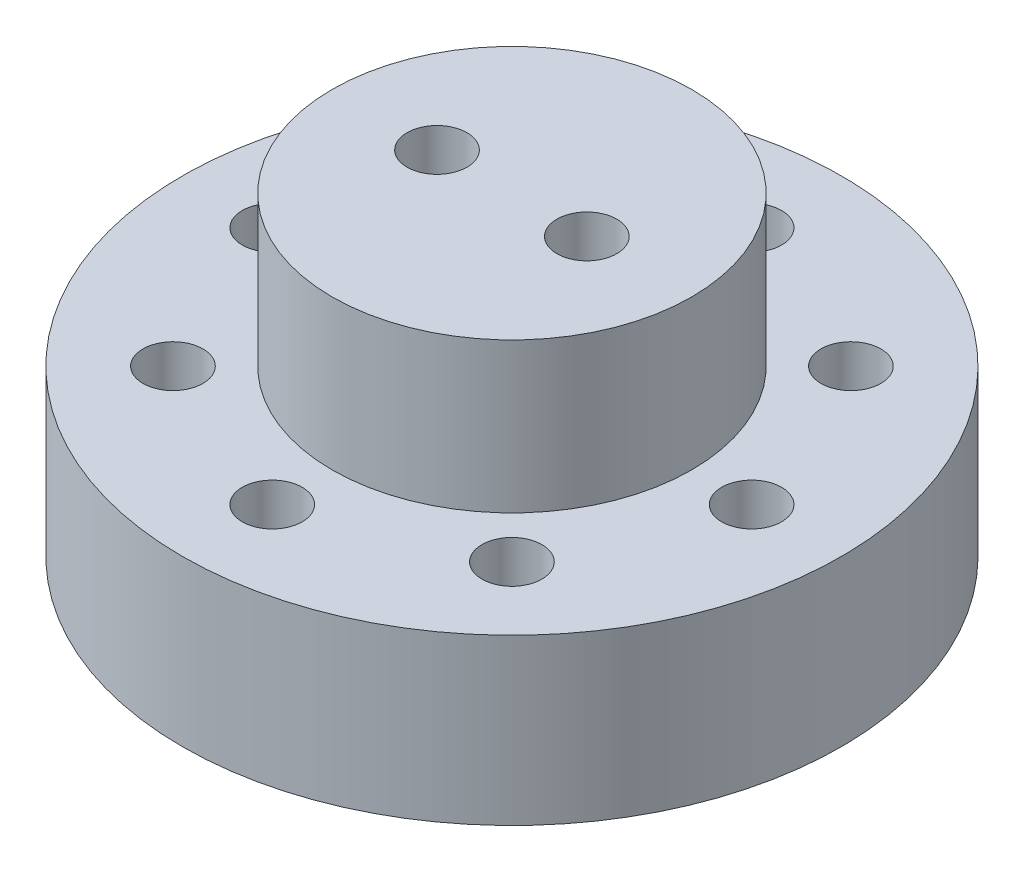
ISO-10303-21;
HEADER;
FILE_DESCRIPTION(('STEP AP214'),'2;1');
FILE_NAME('part.step','',(''),(''),'','','');
FILE_SCHEMA(('AUTOMOTIVE_DESIGN { 1 0 10303 214 1 1 1 1 }'));
ENDSEC;
DATA;
#1=APPLICATION_CONTEXT('core data for automotive mechanical design processes');
#2=APPLICATION_PROTOCOL_DEFINITION('international standard','automotive_design',2000,#1);
#3=PRODUCT_CONTEXT('',#1,'mechanical');
#4=PRODUCT('Part','Part','',(#3));
#5=PRODUCT_RELATED_PRODUCT_CATEGORY('part','',(#4));
#6=PRODUCT_DEFINITION_FORMATION('','',#4);
#7=PRODUCT_DEFINITION_CONTEXT('part definition',#1,'design');
#8=PRODUCT_DEFINITION('design','',#6,#7);
#9=PRODUCT_DEFINITION_SHAPE('','',#8);
#10=(LENGTH_UNIT() NAMED_UNIT(*) SI_UNIT(.MILLI.,.METRE.));
#11=(NAMED_UNIT(*) PLANE_ANGLE_UNIT() SI_UNIT($,.RADIAN.));
#12=(NAMED_UNIT(*) SI_UNIT($,.STERADIAN.) SOLID_ANGLE_UNIT());
#13=UNCERTAINTY_MEASURE_WITH_UNIT(LENGTH_MEASURE(1.E-05),#10,'distance_accuracy_value','');
#14=(GEOMETRIC_REPRESENTATION_CONTEXT(3) GLOBAL_UNCERTAINTY_ASSIGNED_CONTEXT((#13)) GLOBAL_UNIT_ASSIGNED_CONTEXT((#10,
#11,#12)) REPRESENTATION_CONTEXT('',''));
#15=CARTESIAN_POINT('',(0.,0.,0.));
#16=DIRECTION('',(0.,0.,1.));
#17=DIRECTION('',(1.,0.,0.));
#18=AXIS2_PLACEMENT_3D('',#15,#16,#17);
#19=CARTESIAN_POINT('',(0.,5.5,0.));
#20=DIRECTION('',(0.,1.,0.));
#21=DIRECTION('',(0.,0.,1.));
#22=AXIS2_PLACEMENT_3D('',#19,#20,#21);
#23=PLANE('',#22);
#24=CARTESIAN_POINT('',(0.,5.5,0.));
#25=DIRECTION('',(0.,1.,0.));
#26=DIRECTION('',(0.,0.,1.));
#27=AXIS2_PLACEMENT_3D('',#24,#25,#26);
#28=CIRCLE('',#27,6.);
#29=CARTESIAN_POINT('',(0.,5.5,6.));
#30=VERTEX_POINT('',#29);
#31=EDGE_CURVE('E104',#30,#30,#28,.T.);
#32=ORIENTED_EDGE('',*,*,#31,.F.);
#33=EDGE_LOOP('',(#32));
#34=FACE_BOUND('',#33,.T.);
#35=CARTESIAN_POINT('',(-8.,5.5,6.82091801405444E-13));
#36=DIRECTION('',(0.,1.,0.));
#37=DIRECTION('',(0.,0.,1.));
#38=AXIS2_PLACEMENT_3D('',#35,#36,#37);
#39=CIRCLE('',#38,1.00000000000073);
#40=CARTESIAN_POINT('',(-8.,5.5,1.00000000000141));
#41=VERTEX_POINT('',#40);
#42=EDGE_CURVE('E83',#41,#41,#39,.T.);
#43=ORIENTED_EDGE('',*,*,#42,.F.);
#44=EDGE_LOOP('',(#43));
#45=FACE_BOUND('',#44,.T.);
#46=CARTESIAN_POINT('',(6.82212565349343E-13,5.5,8.00000000000068));
#47=DIRECTION('',(0.,1.,0.));
#48=DIRECTION('',(0.,0.,1.));
#49=AXIS2_PLACEMENT_3D('',#46,#47,#48);
#50=CIRCLE('',#49,1.00000000000051);
#51=CARTESIAN_POINT('',(6.82212565349343E-13,5.5,9.00000000000119));
#52=VERTEX_POINT('',#51);
#53=EDGE_CURVE('E71',#52,#52,#50,.T.);
#54=ORIENTED_EDGE('',*,*,#53,.F.);
#55=EDGE_LOOP('',(#54));
#56=FACE_BOUND('',#55,.T.);
#57=CARTESIAN_POINT('',(8.00000000000068,5.5,0.));
#58=DIRECTION('',(0.,1.,0.));
#59=DIRECTION('',(0.,0.,1.));
#60=AXIS2_PLACEMENT_3D('',#57,#58,#59);
#61=CIRCLE('',#60,0.999999999999828);
#62=CARTESIAN_POINT('',(8.00000000000068,5.5,0.999999999999828));
#63=VERTEX_POINT('',#62);
#64=EDGE_CURVE('E59',#63,#63,#61,.T.);
#65=ORIENTED_EDGE('',*,*,#64,.F.);
#66=EDGE_LOOP('',(#65));
#67=FACE_BOUND('',#66,.T.);
#68=CARTESIAN_POINT('',(0.,5.5,-8.));
#69=DIRECTION('',(0.,1.,0.));
#70=DIRECTION('',(0.,0.,1.));
#71=AXIS2_PLACEMENT_3D('',#68,#69,#70);
#72=CIRCLE('',#71,1.);
#73=CARTESIAN_POINT('',(0.,5.5,-7.));
#74=VERTEX_POINT('',#73);
#75=EDGE_CURVE('E48',#74,#74,#72,.T.);
#76=ORIENTED_EDGE('',*,*,#75,.F.);
#77=EDGE_LOOP('',(#76));
#78=FACE_BOUND('',#77,.T.);
#79=CARTESIAN_POINT('',(0.,5.5,0.));
#80=DIRECTION('',(0.,1.,0.));
#81=DIRECTION('',(0.,0.,1.));
#82=AXIS2_PLACEMENT_3D('',#79,#80,#81);
#83=CIRCLE('',#82,11.);
#84=CARTESIAN_POINT('',(0.,5.5,11.));
#85=VERTEX_POINT('',#84);
#86=EDGE_CURVE('E10',#85,#85,#83,.T.);
#87=ORIENTED_EDGE('',*,*,#86,.T.);
#88=EDGE_LOOP('',(#87));
#89=FACE_BOUND('',#88,.T.);
#90=CARTESIAN_POINT('',(5.65685424949272,5.5,-5.65685424949252));
#91=DIRECTION('',(0.,1.,0.));
#92=DIRECTION('',(0.,0.,1.));
#93=AXIS2_PLACEMENT_3D('',#90,#91,#92);
#94=CIRCLE('',#93,0.99999999999978);
#95=CARTESIAN_POINT('',(5.65685424949272,5.5,-4.65685424949274));
#96=VERTEX_POINT('',#95);
#97=EDGE_CURVE('E53',#96,#96,#94,.T.);
#98=ORIENTED_EDGE('',*,*,#97,.F.);
#99=EDGE_LOOP('',(#98));
#100=FACE_BOUND('',#99,.T.);
#101=CARTESIAN_POINT('',(5.6568542494932,5.5,5.65685424949272));
#102=DIRECTION('',(0.,1.,0.));
#103=DIRECTION('',(0.,0.,1.));
#104=AXIS2_PLACEMENT_3D('',#101,#102,#103);
#105=CIRCLE('',#104,1.00000000000013);
#106=CARTESIAN_POINT('',(5.6568542494932,5.5,6.65685424949285));
#107=VERTEX_POINT('',#106);
#108=EDGE_CURVE('E65',#107,#107,#105,.T.);
#109=ORIENTED_EDGE('',*,*,#108,.F.);
#110=EDGE_LOOP('',(#109));
#111=FACE_BOUND('',#110,.T.);
#112=CARTESIAN_POINT('',(-5.65685424949204,5.5,5.6568542494932));
#113=DIRECTION('',(0.,1.,0.));
#114=DIRECTION('',(0.,0.,1.));
#115=AXIS2_PLACEMENT_3D('',#112,#113,#114);
#116=CIRCLE('',#115,1.00000000000076);
#117=CARTESIAN_POINT('',(-5.65685424949204,5.5,6.65685424949396));
#118=VERTEX_POINT('',#117);
#119=EDGE_CURVE('E77',#118,#118,#116,.T.);
#120=ORIENTED_EDGE('',*,*,#119,.F.);
#121=EDGE_LOOP('',(#120));
#122=FACE_BOUND('',#121,.T.);
#123=CARTESIAN_POINT('',(-5.65685424949252,5.5,-5.65685424949204));
#124=DIRECTION('',(0.,1.,0.));
#125=DIRECTION('',(0.,0.,1.));
#126=AXIS2_PLACEMENT_3D('',#123,#124,#125);
#127=CIRCLE('',#126,1.00000000000046);
#128=CARTESIAN_POINT('',(-5.65685424949252,5.5,-4.65685424949158));
#129=VERTEX_POINT('',#128);
#130=EDGE_CURVE('E89',#129,#129,#127,.T.);
#131=ORIENTED_EDGE('',*,*,#130,.F.);
#132=EDGE_LOOP('',(#131));
#133=FACE_BOUND('',#132,.T.);
#134=ADVANCED_FACE('F37',(#34,#45,#56,#67,#78,#89,#100,#111,#122,#133),#23,.T.);
#135=CARTESIAN_POINT('',(0.,0.,0.));
#136=DIRECTION('',(0.,1.,0.));
#137=DIRECTION('',(0.,0.,1.));
#138=AXIS2_PLACEMENT_3D('',#135,#136,#137);
#139=PLANE('',#138);
#140=CARTESIAN_POINT('',(0.,0.,0.));
#141=DIRECTION('',(0.,1.,0.));
#142=DIRECTION('',(0.,0.,1.));
#143=AXIS2_PLACEMENT_3D('',#140,#141,#142);
#144=CIRCLE('',#143,4.);
#145=CARTESIAN_POINT('',(0.,0.,4.));
#146=VERTEX_POINT('',#145);
#147=EDGE_CURVE('E95',#146,#146,#144,.T.);
#148=ORIENTED_EDGE('',*,*,#147,.T.);
#149=EDGE_LOOP('',(#148));
#150=FACE_BOUND('',#149,.T.);
#151=CARTESIAN_POINT('',(0.,0.,0.));
#152=DIRECTION('',(0.,1.,0.));
#153=DIRECTION('',(0.,0.,1.));
#154=AXIS2_PLACEMENT_3D('',#151,#152,#153);
#155=CIRCLE('',#154,11.);
#156=CARTESIAN_POINT('',(0.,0.,11.));
#157=VERTEX_POINT('',#156);
#158=EDGE_CURVE('E41',#157,#157,#155,.T.);
#159=ORIENTED_EDGE('',*,*,#158,.F.);
#160=EDGE_LOOP('',(#159));
#161=FACE_BOUND('',#160,.T.);
#162=CARTESIAN_POINT('',(0.,0.,-8.));
#163=DIRECTION('',(0.,1.,0.));
#164=DIRECTION('',(0.,0.,1.));
#165=AXIS2_PLACEMENT_3D('',#162,#163,#164);
#166=CIRCLE('',#165,1.);
#167=CARTESIAN_POINT('',(0.,0.,-7.));
#168=VERTEX_POINT('',#167);
#169=EDGE_CURVE('E50',#168,#168,#166,.T.);
#170=ORIENTED_EDGE('',*,*,#169,.T.);
#171=EDGE_LOOP('',(#170));
#172=FACE_BOUND('',#171,.T.);
#173=CARTESIAN_POINT('',(5.65685424949272,0.,-5.65685424949252));
#174=DIRECTION('',(0.,1.,0.));
#175=DIRECTION('',(0.,0.,1.));
#176=AXIS2_PLACEMENT_3D('',#173,#174,#175);
#177=CIRCLE('',#176,0.99999999999978);
#178=CARTESIAN_POINT('',(5.65685424949272,0.,-4.65685424949274));
#179=VERTEX_POINT('',#178);
#180=EDGE_CURVE('E56',#179,#179,#177,.T.);
#181=ORIENTED_EDGE('',*,*,#180,.T.);
#182=EDGE_LOOP('',(#181));
#183=FACE_BOUND('',#182,.T.);
#184=CARTESIAN_POINT('',(8.00000000000068,0.,0.));
#185=DIRECTION('',(0.,1.,0.));
#186=DIRECTION('',(0.,0.,1.));
#187=AXIS2_PLACEMENT_3D('',#184,#185,#186);
#188=CIRCLE('',#187,0.999999999999828);
#189=CARTESIAN_POINT('',(8.00000000000068,0.,0.999999999999828));
#190=VERTEX_POINT('',#189);
#191=EDGE_CURVE('E62',#190,#190,#188,.T.);
#192=ORIENTED_EDGE('',*,*,#191,.T.);
#193=EDGE_LOOP('',(#192));
#194=FACE_BOUND('',#193,.T.);
#195=CARTESIAN_POINT('',(5.6568542494932,0.,5.65685424949272));
#196=DIRECTION('',(0.,1.,0.));
#197=DIRECTION('',(0.,0.,1.));
#198=AXIS2_PLACEMENT_3D('',#195,#196,#197);
#199=CIRCLE('',#198,1.00000000000013);
#200=CARTESIAN_POINT('',(5.6568542494932,0.,6.65685424949285));
#201=VERTEX_POINT('',#200);
#202=EDGE_CURVE('E68',#201,#201,#199,.T.);
#203=ORIENTED_EDGE('',*,*,#202,.T.);
#204=EDGE_LOOP('',(#203));
#205=FACE_BOUND('',#204,.T.);
#206=CARTESIAN_POINT('',(6.82212565349343E-13,0.,8.00000000000068));
#207=DIRECTION('',(0.,1.,0.));
#208=DIRECTION('',(0.,0.,1.));
#209=AXIS2_PLACEMENT_3D('',#206,#207,#208);
#210=CIRCLE('',#209,1.00000000000051);
#211=CARTESIAN_POINT('',(6.82212565349343E-13,0.,9.00000000000119));
#212=VERTEX_POINT('',#211);
#213=EDGE_CURVE('E74',#212,#212,#210,.T.);
#214=ORIENTED_EDGE('',*,*,#213,.T.);
#215=EDGE_LOOP('',(#214));
#216=FACE_BOUND('',#215,.T.);
#217=CARTESIAN_POINT('',(-5.65685424949204,0.,5.6568542494932));
#218=DIRECTION('',(0.,1.,0.));
#219=DIRECTION('',(0.,0.,1.));
#220=AXIS2_PLACEMENT_3D('',#217,#218,#219);
#221=CIRCLE('',#220,1.00000000000076);
#222=CARTESIAN_POINT('',(-5.65685424949204,0.,6.65685424949396));
#223=VERTEX_POINT('',#222);
#224=EDGE_CURVE('E80',#223,#223,#221,.T.);
#225=ORIENTED_EDGE('',*,*,#224,.T.);
#226=EDGE_LOOP('',(#225));
#227=FACE_BOUND('',#226,.T.);
#228=CARTESIAN_POINT('',(-8.,0.,6.82091801405444E-13));
#229=DIRECTION('',(0.,1.,0.));
#230=DIRECTION('',(0.,0.,1.));
#231=AXIS2_PLACEMENT_3D('',#228,#229,#230);
#232=CIRCLE('',#231,1.00000000000073);
#233=CARTESIAN_POINT('',(-8.,0.,1.00000000000141));
#234=VERTEX_POINT('',#233);
#235=EDGE_CURVE('E86',#234,#234,#232,.T.);
#236=ORIENTED_EDGE('',*,*,#235,.T.);
#237=EDGE_LOOP('',(#236));
#238=FACE_BOUND('',#237,.T.);
#239=CARTESIAN_POINT('',(-5.65685424949252,0.,-5.65685424949204));
#240=DIRECTION('',(0.,1.,0.));
#241=DIRECTION('',(0.,0.,1.));
#242=AXIS2_PLACEMENT_3D('',#239,#240,#241);
#243=CIRCLE('',#242,1.00000000000046);
#244=CARTESIAN_POINT('',(-5.65685424949252,0.,-4.65685424949158));
#245=VERTEX_POINT('',#244);
#246=EDGE_CURVE('E92',#245,#245,#243,.T.);
#247=ORIENTED_EDGE('',*,*,#246,.T.);
#248=EDGE_LOOP('',(#247));
#249=FACE_BOUND('',#248,.T.);
#250=ADVANCED_FACE('F143',(#150,#161,#172,#183,#194,#205,#216,#227,#238,#249),#139,.F.);
#251=CARTESIAN_POINT('',(0.,5.5,0.));
#252=DIRECTION('',(0.,-1.,0.));
#253=DIRECTION('',(0.,0.,-1.));
#254=AXIS2_PLACEMENT_3D('',#251,#252,#253);
#255=CYLINDRICAL_SURFACE('',#254,11.);
#256=ORIENTED_EDGE('',*,*,#86,.F.);
#257=EDGE_LOOP('',(#256));
#258=FACE_BOUND('',#257,.T.);
#259=ORIENTED_EDGE('',*,*,#158,.T.);
#260=EDGE_LOOP('',(#259));
#261=FACE_BOUND('',#260,.T.);
#262=ADVANCED_FACE('F39',(#258,#261),#255,.T.);
#263=CARTESIAN_POINT('',(0.,5.5,-8.));
#264=DIRECTION('',(0.,-1.,0.));
#265=DIRECTION('',(0.,0.,-1.));
#266=AXIS2_PLACEMENT_3D('',#263,#264,#265);
#267=CYLINDRICAL_SURFACE('',#266,1.);
#268=ORIENTED_EDGE('',*,*,#75,.T.);
#269=EDGE_LOOP('',(#268));
#270=FACE_BOUND('',#269,.T.);
#271=ORIENTED_EDGE('',*,*,#169,.F.);
#272=EDGE_LOOP('',(#271));
#273=FACE_BOUND('',#272,.T.);
#274=ADVANCED_FACE('F174',(#270,#273),#267,.F.);
#275=CARTESIAN_POINT('',(5.65685424949272,5.5,-5.65685424949252));
#276=DIRECTION('',(0.,-1.,0.));
#277=DIRECTION('',(0.,0.,-1.));
#278=AXIS2_PLACEMENT_3D('',#275,#276,#277);
#279=CYLINDRICAL_SURFACE('',#278,0.99999999999978);
#280=ORIENTED_EDGE('',*,*,#97,.T.);
#281=EDGE_LOOP('',(#280));
#282=FACE_BOUND('',#281,.T.);
#283=ORIENTED_EDGE('',*,*,#180,.F.);
#284=EDGE_LOOP('',(#283));
#285=FACE_BOUND('',#284,.T.);
#286=ADVANCED_FACE('F180',(#282,#285),#279,.F.);
#287=CARTESIAN_POINT('',(8.00000000000068,5.5,0.));
#288=DIRECTION('',(0.,-1.,0.));
#289=DIRECTION('',(0.,0.,-1.));
#290=AXIS2_PLACEMENT_3D('',#287,#288,#289);
#291=CYLINDRICAL_SURFACE('',#290,0.999999999999828);
#292=ORIENTED_EDGE('',*,*,#64,.T.);
#293=EDGE_LOOP('',(#292));
#294=FACE_BOUND('',#293,.T.);
#295=ORIENTED_EDGE('',*,*,#191,.F.);
#296=EDGE_LOOP('',(#295));
#297=FACE_BOUND('',#296,.T.);
#298=ADVANCED_FACE('F184',(#294,#297),#291,.F.);
#299=CARTESIAN_POINT('',(5.6568542494932,5.5,5.65685424949272));
#300=DIRECTION('',(0.,-1.,0.));
#301=DIRECTION('',(0.,0.,-1.));
#302=AXIS2_PLACEMENT_3D('',#299,#300,#301);
#303=CYLINDRICAL_SURFACE('',#302,1.00000000000013);
#304=ORIENTED_EDGE('',*,*,#108,.T.);
#305=EDGE_LOOP('',(#304));
#306=FACE_BOUND('',#305,.T.);
#307=ORIENTED_EDGE('',*,*,#202,.F.);
#308=EDGE_LOOP('',(#307));
#309=FACE_BOUND('',#308,.T.);
#310=ADVANCED_FACE('F188',(#306,#309),#303,.F.);
#311=CARTESIAN_POINT('',(6.82212565349343E-13,5.5,8.00000000000068));
#312=DIRECTION('',(0.,-1.,0.));
#313=DIRECTION('',(0.,0.,-1.));
#314=AXIS2_PLACEMENT_3D('',#311,#312,#313);
#315=CYLINDRICAL_SURFACE('',#314,1.00000000000051);
#316=ORIENTED_EDGE('',*,*,#53,.T.);
#317=EDGE_LOOP('',(#316));
#318=FACE_BOUND('',#317,.T.);
#319=ORIENTED_EDGE('',*,*,#213,.F.);
#320=EDGE_LOOP('',(#319));
#321=FACE_BOUND('',#320,.T.);
#322=ADVANCED_FACE('F192',(#318,#321),#315,.F.);
#323=CARTESIAN_POINT('',(-5.65685424949204,5.5,5.6568542494932));
#324=DIRECTION('',(0.,-1.,0.));
#325=DIRECTION('',(0.,0.,-1.));
#326=AXIS2_PLACEMENT_3D('',#323,#324,#325);
#327=CYLINDRICAL_SURFACE('',#326,1.00000000000076);
#328=ORIENTED_EDGE('',*,*,#119,.T.);
#329=EDGE_LOOP('',(#328));
#330=FACE_BOUND('',#329,.T.);
#331=ORIENTED_EDGE('',*,*,#224,.F.);
#332=EDGE_LOOP('',(#331));
#333=FACE_BOUND('',#332,.T.);
#334=ADVANCED_FACE('F196',(#330,#333),#327,.F.);
#335=CARTESIAN_POINT('',(-8.,5.5,6.82091801405444E-13));
#336=DIRECTION('',(0.,-1.,0.));
#337=DIRECTION('',(0.,0.,-1.));
#338=AXIS2_PLACEMENT_3D('',#335,#336,#337);
#339=CYLINDRICAL_SURFACE('',#338,1.00000000000073);
#340=ORIENTED_EDGE('',*,*,#42,.T.);
#341=EDGE_LOOP('',(#340));
#342=FACE_BOUND('',#341,.T.);
#343=ORIENTED_EDGE('',*,*,#235,.F.);
#344=EDGE_LOOP('',(#343));
#345=FACE_BOUND('',#344,.T.);
#346=ADVANCED_FACE('F165',(#342,#345),#339,.F.);
#347=CARTESIAN_POINT('',(-5.65685424949252,5.5,-5.65685424949204));
#348=DIRECTION('',(0.,-1.,0.));
#349=DIRECTION('',(0.,0.,-1.));
#350=AXIS2_PLACEMENT_3D('',#347,#348,#349);
#351=CYLINDRICAL_SURFACE('',#350,1.00000000000046);
#352=ORIENTED_EDGE('',*,*,#130,.T.);
#353=EDGE_LOOP('',(#352));
#354=FACE_BOUND('',#353,.T.);
#355=ORIENTED_EDGE('',*,*,#246,.F.);
#356=EDGE_LOOP('',(#355));
#357=FACE_BOUND('',#356,.T.);
#358=ADVANCED_FACE('F161',(#354,#357),#351,.F.);
#359=CARTESIAN_POINT('',(0.,0.,0.));
#360=DIRECTION('',(0.,1.,0.));
#361=DIRECTION('',(0.,0.,1.));
#362=AXIS2_PLACEMENT_3D('',#359,#360,#361);
#363=CYLINDRICAL_SURFACE('',#362,4.);
#364=ORIENTED_EDGE('',*,*,#147,.F.);
#365=EDGE_LOOP('',(#364));
#366=FACE_BOUND('',#365,.T.);
#367=CARTESIAN_POINT('',(0.,5.5,0.));
#368=DIRECTION('',(0.,1.,0.));
#369=DIRECTION('',(0.,0.,1.));
#370=AXIS2_PLACEMENT_3D('',#367,#368,#369);
#371=CIRCLE('',#370,4.);
#372=CARTESIAN_POINT('',(0.,5.5,4.));
#373=VERTEX_POINT('',#372);
#374=EDGE_CURVE('E100',#373,#373,#371,.F.);
#375=ORIENTED_EDGE('',*,*,#374,.F.);
#376=EDGE_LOOP('',(#375));
#377=FACE_BOUND('',#376,.T.);
#378=ADVANCED_FACE('F164',(#366,#377),#363,.F.);
#379=CARTESIAN_POINT('',(0.,5.5,0.));
#380=DIRECTION('',(0.,1.,0.));
#381=DIRECTION('',(0.,0.,1.));
#382=AXIS2_PLACEMENT_3D('',#379,#380,#381);
#383=PLANE('',#382);
#384=CARTESIAN_POINT('',(-2.5,5.5,0.));
#385=DIRECTION('',(0.,1.,0.));
#386=DIRECTION('',(0.,0.,1.));
#387=AXIS2_PLACEMENT_3D('',#384,#385,#386);
#388=CIRCLE('',#387,1.);
#389=CARTESIAN_POINT('',(-2.5,5.5,1.));
#390=VERTEX_POINT('',#389);
#391=EDGE_CURVE('E107',#390,#390,#388,.T.);
#392=ORIENTED_EDGE('',*,*,#391,.T.);
#393=EDGE_LOOP('',(#392));
#394=FACE_BOUND('',#393,.T.);
#395=CARTESIAN_POINT('',(2.5,5.5,0.));
#396=DIRECTION('',(0.,1.,0.));
#397=DIRECTION('',(0.,0.,1.));
#398=AXIS2_PLACEMENT_3D('',#395,#396,#397);
#399=CIRCLE('',#398,1.);
#400=CARTESIAN_POINT('',(2.5,5.5,0.999999999999999));
#401=VERTEX_POINT('',#400);
#402=EDGE_CURVE('E112',#401,#401,#399,.T.);
#403=ORIENTED_EDGE('',*,*,#402,.T.);
#404=EDGE_LOOP('',(#403));
#405=FACE_BOUND('',#404,.T.);
#406=ORIENTED_EDGE('',*,*,#374,.T.);
#407=EDGE_LOOP('',(#406));
#408=FACE_BOUND('',#407,.T.);
#409=ADVANCED_FACE('F137',(#394,#405,#408),#383,.F.);
#410=CARTESIAN_POINT('',(0.,10.5,0.));
#411=DIRECTION('',(0.,-1.,0.));
#412=DIRECTION('',(0.,0.,-1.));
#413=AXIS2_PLACEMENT_3D('',#410,#411,#412);
#414=CYLINDRICAL_SURFACE('',#413,6.);
#415=CARTESIAN_POINT('',(0.,10.5,0.));
#416=DIRECTION('',(0.,1.,0.));
#417=DIRECTION('',(0.,0.,1.));
#418=AXIS2_PLACEMENT_3D('',#415,#416,#417);
#419=CIRCLE('',#418,6.);
#420=CARTESIAN_POINT('',(0.,10.5,6.));
#421=VERTEX_POINT('',#420);
#422=EDGE_CURVE('E103',#421,#421,#419,.T.);
#423=ORIENTED_EDGE('',*,*,#422,.F.);
#424=EDGE_LOOP('',(#423));
#425=FACE_BOUND('',#424,.T.);
#426=ORIENTED_EDGE('',*,*,#31,.T.);
#427=EDGE_LOOP('',(#426));
#428=FACE_BOUND('',#427,.T.);
#429=ADVANCED_FACE('F129',(#425,#428),#414,.T.);
#430=CARTESIAN_POINT('',(0.,10.5,0.));
#431=DIRECTION('',(0.,1.,0.));
#432=DIRECTION('',(0.,0.,1.));
#433=AXIS2_PLACEMENT_3D('',#430,#431,#432);
#434=PLANE('',#433);
#435=CARTESIAN_POINT('',(-2.5,10.5,0.));
#436=DIRECTION('',(0.,1.,0.));
#437=DIRECTION('',(0.,0.,1.));
#438=AXIS2_PLACEMENT_3D('',#435,#436,#437);
#439=CIRCLE('',#438,1.);
#440=CARTESIAN_POINT('',(-2.5,10.5,1.));
#441=VERTEX_POINT('',#440);
#442=EDGE_CURVE('E115',#441,#441,#439,.T.);
#443=ORIENTED_EDGE('',*,*,#442,.F.);
#444=EDGE_LOOP('',(#443));
#445=FACE_BOUND('',#444,.T.);
#446=CARTESIAN_POINT('',(2.5,10.5,0.));
#447=DIRECTION('',(0.,1.,0.));
#448=DIRECTION('',(0.,0.,1.));
#449=AXIS2_PLACEMENT_3D('',#446,#447,#448);
#450=CIRCLE('',#449,1.);
#451=CARTESIAN_POINT('',(2.5,10.5,0.999999999999999));
#452=VERTEX_POINT('',#451);
#453=EDGE_CURVE('E116',#452,#452,#450,.T.);
#454=ORIENTED_EDGE('',*,*,#453,.F.);
#455=EDGE_LOOP('',(#454));
#456=FACE_BOUND('',#455,.T.);
#457=ORIENTED_EDGE('',*,*,#422,.T.);
#458=EDGE_LOOP('',(#457));
#459=FACE_BOUND('',#458,.T.);
#460=ADVANCED_FACE('F125',(#445,#456,#459),#434,.T.);
#461=CARTESIAN_POINT('',(2.5,0.,0.));
#462=DIRECTION('',(0.,1.,0.));
#463=DIRECTION('',(0.,0.,1.));
#464=AXIS2_PLACEMENT_3D('',#461,#462,#463);
#465=CYLINDRICAL_SURFACE('',#464,1.);
#466=ORIENTED_EDGE('',*,*,#453,.T.);
#467=EDGE_LOOP('',(#466));
#468=FACE_BOUND('',#467,.T.);
#469=ORIENTED_EDGE('',*,*,#402,.F.);
#470=EDGE_LOOP('',(#469));
#471=FACE_BOUND('',#470,.T.);
#472=ADVANCED_FACE('F128',(#468,#471),#465,.F.);
#473=CARTESIAN_POINT('',(-2.5,0.,0.));
#474=DIRECTION('',(0.,1.,0.));
#475=DIRECTION('',(0.,0.,1.));
#476=AXIS2_PLACEMENT_3D('',#473,#474,#475);
#477=CYLINDRICAL_SURFACE('',#476,1.);
#478=ORIENTED_EDGE('',*,*,#442,.T.);
#479=EDGE_LOOP('',(#478));
#480=FACE_BOUND('',#479,.T.);
#481=ORIENTED_EDGE('',*,*,#391,.F.);
#482=EDGE_LOOP('',(#481));
#483=FACE_BOUND('',#482,.T.);
#484=ADVANCED_FACE('F122',(#480,#483),#477,.F.);
#485=CLOSED_SHELL('',(#134,#250,#262,#274,#286,#298,#310,#322,#334,#346,#358,#378,#409,#429,
#460,#472,#484));
#486=MANIFOLD_SOLID_BREP('B2',#485);
#487=ADVANCED_BREP_SHAPE_REPRESENTATION('',(#18,#486),#14);
#488=SHAPE_DEFINITION_REPRESENTATION(#9,#487);
ENDSEC;
END-ISO-10303-21;
